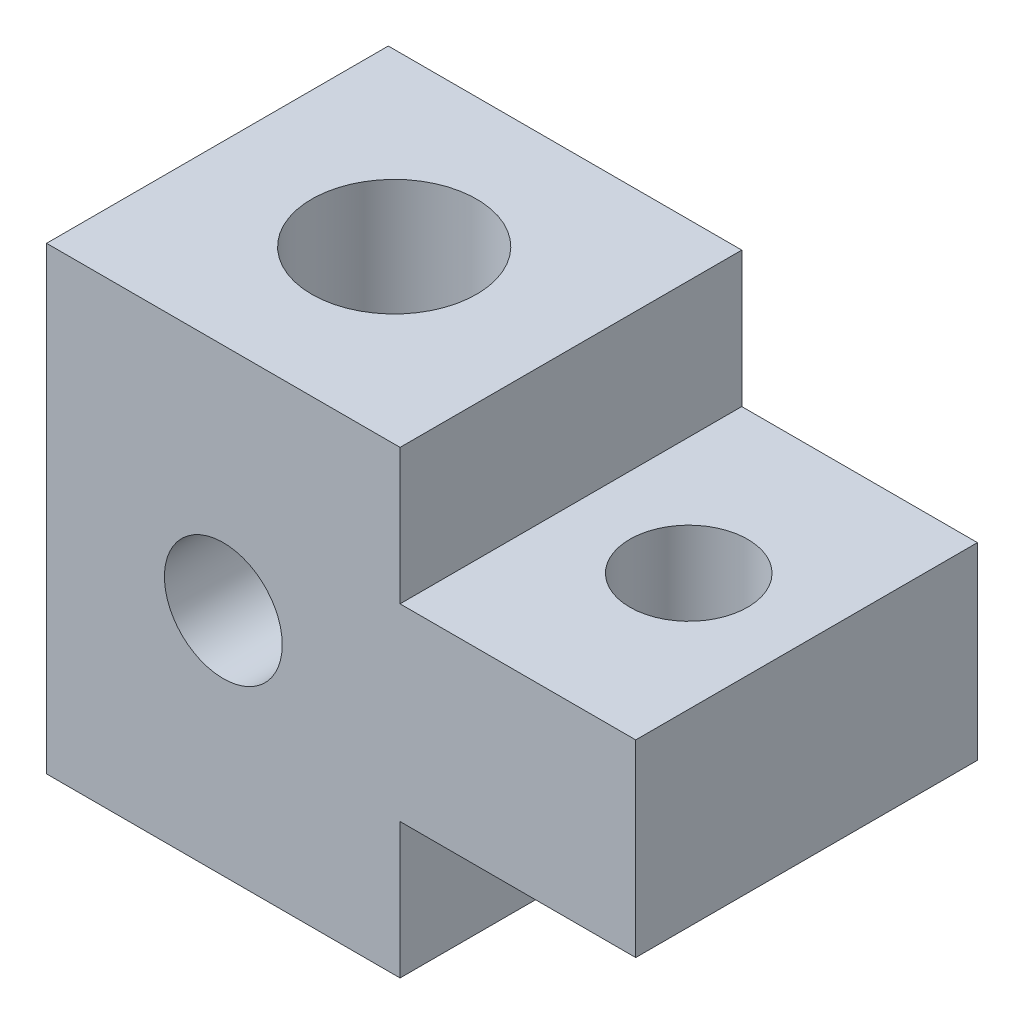
ISO-10303-21;
HEADER;
FILE_DESCRIPTION(('STEP AP214'),'2;1');
FILE_NAME('part.step','',(''),(''),'','','');
FILE_SCHEMA(('AUTOMOTIVE_DESIGN { 1 0 10303 214 1 1 1 1 }'));
ENDSEC;
DATA;
#1=APPLICATION_CONTEXT('core data for automotive mechanical design processes');
#2=APPLICATION_PROTOCOL_DEFINITION('international standard','automotive_design',2000,#1);
#3=PRODUCT_CONTEXT('',#1,'mechanical');
#4=PRODUCT('Part','Part','',(#3));
#5=PRODUCT_RELATED_PRODUCT_CATEGORY('part','',(#4));
#6=PRODUCT_DEFINITION_FORMATION('','',#4);
#7=PRODUCT_DEFINITION_CONTEXT('part definition',#1,'design');
#8=PRODUCT_DEFINITION('design','',#6,#7);
#9=PRODUCT_DEFINITION_SHAPE('','',#8);
#10=(LENGTH_UNIT() NAMED_UNIT(*) SI_UNIT(.MILLI.,.METRE.));
#11=(NAMED_UNIT(*) PLANE_ANGLE_UNIT() SI_UNIT($,.RADIAN.));
#12=(NAMED_UNIT(*) SI_UNIT($,.STERADIAN.) SOLID_ANGLE_UNIT());
#13=UNCERTAINTY_MEASURE_WITH_UNIT(LENGTH_MEASURE(1.E-05),#10,'distance_accuracy_value','');
#14=(GEOMETRIC_REPRESENTATION_CONTEXT(3) GLOBAL_UNCERTAINTY_ASSIGNED_CONTEXT((#13)) GLOBAL_UNIT_ASSIGNED_CONTEXT((#10,
#11,#12)) REPRESENTATION_CONTEXT('',''));
#15=CARTESIAN_POINT('',(0.,0.,0.));
#16=DIRECTION('',(0.,0.,1.));
#17=DIRECTION('',(1.,0.,0.));
#18=AXIS2_PLACEMENT_3D('',#15,#16,#17);
#19=CARTESIAN_POINT('',(0.,0.,29.));
#20=DIRECTION('',(-1.,0.,0.));
#21=DIRECTION('',(0.,0.,1.));
#22=AXIS2_PLACEMENT_3D('',#19,#20,#21);
#23=PLANE('',#22);
#24=DIRECTION('',(0.,1.,0.));
#25=VECTOR('',#24,1.);
#26=CARTESIAN_POINT('',(0.,0.,0.));
#27=LINE('',#26,#25);
#28=CARTESIAN_POINT('',(0.,-19.5,0.));
#29=VERTEX_POINT('',#28);
#30=CARTESIAN_POINT('',(0.,19.5,0.));
#31=VERTEX_POINT('',#30);
#32=EDGE_CURVE('E142',#29,#31,#27,.T.);
#33=ORIENTED_EDGE('',*,*,#32,.F.);
#34=DIRECTION('',(0.,0.,-1.));
#35=VECTOR('',#34,1.);
#36=CARTESIAN_POINT('',(0.,-19.5,29.));
#37=LINE('',#36,#35);
#38=CARTESIAN_POINT('',(0.,-19.5,29.));
#39=VERTEX_POINT('',#38);
#40=EDGE_CURVE('E11',#39,#29,#37,.T.);
#41=ORIENTED_EDGE('',*,*,#40,.F.);
#42=DIRECTION('',(0.,1.,0.));
#43=VECTOR('',#42,1.);
#44=CARTESIAN_POINT('',(0.,0.,29.));
#45=LINE('',#44,#43);
#46=CARTESIAN_POINT('',(0.,19.5,29.));
#47=VERTEX_POINT('',#46);
#48=EDGE_CURVE('E160',#39,#47,#45,.T.);
#49=ORIENTED_EDGE('',*,*,#48,.T.);
#50=DIRECTION('',(0.,0.,-1.));
#51=VECTOR('',#50,1.);
#52=CARTESIAN_POINT('',(0.,19.5,29.));
#53=LINE('',#52,#51);
#54=EDGE_CURVE('E63',#47,#31,#53,.T.);
#55=ORIENTED_EDGE('',*,*,#54,.T.);
#56=EDGE_LOOP('',(#33,#41,#49,#55));
#57=FACE_BOUND('',#56,.T.);
#58=ADVANCED_FACE('F40',(#57),#23,.T.);
#59=CARTESIAN_POINT('',(0.,-19.5,29.));
#60=DIRECTION('',(0.,1.,0.));
#61=DIRECTION('',(0.,0.,1.));
#62=AXIS2_PLACEMENT_3D('',#59,#60,#61);
#63=PLANE('',#62);
#64=CARTESIAN_POINT('',(15.,-19.5,14.5));
#65=DIRECTION('',(0.,1.,0.));
#66=DIRECTION('',(0.,0.,1.));
#67=AXIS2_PLACEMENT_3D('',#64,#65,#66);
#68=CIRCLE('',#67,7.);
#69=CARTESIAN_POINT('',(15.,-19.5,21.5));
#70=VERTEX_POINT('',#69);
#71=EDGE_CURVE('E174',#70,#70,#68,.T.);
#72=ORIENTED_EDGE('',*,*,#71,.T.);
#73=EDGE_LOOP('',(#72));
#74=FACE_BOUND('',#73,.T.);
#75=DIRECTION('',(1.,0.,0.));
#76=VECTOR('',#75,1.);
#77=CARTESIAN_POINT('',(0.,-19.5,0.));
#78=LINE('',#77,#76);
#79=CARTESIAN_POINT('',(30.,-19.5,0.));
#80=VERTEX_POINT('',#79);
#81=EDGE_CURVE('E144',#29,#80,#78,.T.);
#82=ORIENTED_EDGE('',*,*,#81,.T.);
#83=DIRECTION('',(0.,0.,-1.));
#84=VECTOR('',#83,1.);
#85=CARTESIAN_POINT('',(30.,-19.5,29.));
#86=LINE('',#85,#84);
#87=CARTESIAN_POINT('',(30.,-19.5,29.));
#88=VERTEX_POINT('',#87);
#89=EDGE_CURVE('E54',#88,#80,#86,.T.);
#90=ORIENTED_EDGE('',*,*,#89,.F.);
#91=DIRECTION('',(1.,0.,0.));
#92=VECTOR('',#91,1.);
#93=CARTESIAN_POINT('',(0.,-19.5,29.));
#94=LINE('',#93,#92);
#95=EDGE_CURVE('E246',#39,#88,#94,.T.);
#96=ORIENTED_EDGE('',*,*,#95,.F.);
#97=ORIENTED_EDGE('',*,*,#40,.T.);
#98=EDGE_LOOP('',(#82,#90,#96,#97));
#99=FACE_BOUND('',#98,.T.);
#100=ADVANCED_FACE('F198',(#74,#99),#63,.F.);
#101=CARTESIAN_POINT('',(30.,0.,29.));
#102=DIRECTION('',(-1.,0.,0.));
#103=DIRECTION('',(0.,-1.,0.));
#104=AXIS2_PLACEMENT_3D('',#101,#102,#103);
#105=PLANE('',#104);
#106=DIRECTION('',(0.,1.,0.));
#107=VECTOR('',#106,1.);
#108=CARTESIAN_POINT('',(30.,0.,0.));
#109=LINE('',#108,#107);
#110=CARTESIAN_POINT('',(30.,-8.,0.));
#111=VERTEX_POINT('',#110);
#112=EDGE_CURVE('E147',#80,#111,#109,.T.);
#113=ORIENTED_EDGE('',*,*,#112,.T.);
#114=DIRECTION('',(0.,0.,-1.));
#115=VECTOR('',#114,1.);
#116=CARTESIAN_POINT('',(30.,-8.,29.));
#117=LINE('',#116,#115);
#118=CARTESIAN_POINT('',(30.,-8.,29.));
#119=VERTEX_POINT('',#118);
#120=EDGE_CURVE('E167',#119,#111,#117,.T.);
#121=ORIENTED_EDGE('',*,*,#120,.F.);
#122=DIRECTION('',(0.,1.,0.));
#123=VECTOR('',#122,1.);
#124=CARTESIAN_POINT('',(30.,0.,29.));
#125=LINE('',#124,#123);
#126=EDGE_CURVE('E245',#88,#119,#125,.T.);
#127=ORIENTED_EDGE('',*,*,#126,.F.);
#128=ORIENTED_EDGE('',*,*,#89,.T.);
#129=EDGE_LOOP('',(#113,#121,#127,#128));
#130=FACE_BOUND('',#129,.T.);
#131=ADVANCED_FACE('F202',(#130),#105,.F.);
#132=CARTESIAN_POINT('',(0.,-8.,29.));
#133=DIRECTION('',(0.,1.,0.));
#134=DIRECTION('',(0.,0.,1.));
#135=AXIS2_PLACEMENT_3D('',#132,#133,#134);
#136=PLANE('',#135);
#137=CARTESIAN_POINT('',(40.,-8.,14.5));
#138=DIRECTION('',(0.,1.,0.));
#139=DIRECTION('',(0.,0.,1.));
#140=AXIS2_PLACEMENT_3D('',#137,#138,#139);
#141=CIRCLE('',#140,5.);
#142=CARTESIAN_POINT('',(40.,-8.,19.5));
#143=VERTEX_POINT('',#142);
#144=EDGE_CURVE('E145',#143,#143,#141,.T.);
#145=ORIENTED_EDGE('',*,*,#144,.T.);
#146=EDGE_LOOP('',(#145));
#147=FACE_BOUND('',#146,.T.);
#148=DIRECTION('',(1.,0.,0.));
#149=VECTOR('',#148,1.);
#150=CARTESIAN_POINT('',(0.,-8.,0.));
#151=LINE('',#150,#149);
#152=CARTESIAN_POINT('',(50.,-8.,0.));
#153=VERTEX_POINT('',#152);
#154=EDGE_CURVE('E149',#111,#153,#151,.T.);
#155=ORIENTED_EDGE('',*,*,#154,.T.);
#156=DIRECTION('',(0.,0.,-1.));
#157=VECTOR('',#156,1.);
#158=CARTESIAN_POINT('',(50.,-8.,29.));
#159=LINE('',#158,#157);
#160=CARTESIAN_POINT('',(50.,-8.,29.));
#161=VERTEX_POINT('',#160);
#162=EDGE_CURVE('E164',#161,#153,#159,.T.);
#163=ORIENTED_EDGE('',*,*,#162,.F.);
#164=DIRECTION('',(1.,0.,0.));
#165=VECTOR('',#164,1.);
#166=CARTESIAN_POINT('',(0.,-8.,29.));
#167=LINE('',#166,#165);
#168=EDGE_CURVE('E137',#119,#161,#167,.T.);
#169=ORIENTED_EDGE('',*,*,#168,.F.);
#170=ORIENTED_EDGE('',*,*,#120,.T.);
#171=EDGE_LOOP('',(#155,#163,#169,#170));
#172=FACE_BOUND('',#171,.T.);
#173=ADVANCED_FACE('F228',(#147,#172),#136,.F.);
#174=CARTESIAN_POINT('',(50.,0.,29.));
#175=DIRECTION('',(-1.,0.,0.));
#176=DIRECTION('',(0.,-1.,0.));
#177=AXIS2_PLACEMENT_3D('',#174,#175,#176);
#178=PLANE('',#177);
#179=DIRECTION('',(0.,1.,0.));
#180=VECTOR('',#179,1.);
#181=CARTESIAN_POINT('',(50.,0.,0.));
#182=LINE('',#181,#180);
#183=CARTESIAN_POINT('',(50.,8.,0.));
#184=VERTEX_POINT('',#183);
#185=EDGE_CURVE('E151',#153,#184,#182,.T.);
#186=ORIENTED_EDGE('',*,*,#185,.T.);
#187=DIRECTION('',(0.,0.,-1.));
#188=VECTOR('',#187,1.);
#189=CARTESIAN_POINT('',(50.,8.,29.));
#190=LINE('',#189,#188);
#191=CARTESIAN_POINT('',(50.,8.,29.));
#192=VERTEX_POINT('',#191);
#193=EDGE_CURVE('E123',#192,#184,#190,.T.);
#194=ORIENTED_EDGE('',*,*,#193,.F.);
#195=DIRECTION('',(0.,1.,0.));
#196=VECTOR('',#195,1.);
#197=CARTESIAN_POINT('',(50.,0.,29.));
#198=LINE('',#197,#196);
#199=EDGE_CURVE('E134',#161,#192,#198,.T.);
#200=ORIENTED_EDGE('',*,*,#199,.F.);
#201=ORIENTED_EDGE('',*,*,#162,.T.);
#202=EDGE_LOOP('',(#186,#194,#200,#201));
#203=FACE_BOUND('',#202,.T.);
#204=ADVANCED_FACE('F224',(#203),#178,.F.);
#205=CARTESIAN_POINT('',(0.,8.,29.));
#206=DIRECTION('',(0.,1.,0.));
#207=DIRECTION('',(0.,0.,1.));
#208=AXIS2_PLACEMENT_3D('',#205,#206,#207);
#209=PLANE('',#208);
#210=CARTESIAN_POINT('',(40.,8.,14.5));
#211=DIRECTION('',(0.,1.,0.));
#212=DIRECTION('',(0.,0.,1.));
#213=AXIS2_PLACEMENT_3D('',#210,#211,#212);
#214=CIRCLE('',#213,5.);
#215=CARTESIAN_POINT('',(40.,8.,19.5));
#216=VERTEX_POINT('',#215);
#217=EDGE_CURVE('E172',#216,#216,#214,.T.);
#218=ORIENTED_EDGE('',*,*,#217,.F.);
#219=EDGE_LOOP('',(#218));
#220=FACE_BOUND('',#219,.T.);
#221=DIRECTION('',(1.,0.,0.));
#222=VECTOR('',#221,1.);
#223=CARTESIAN_POINT('',(0.,8.,0.));
#224=LINE('',#223,#222);
#225=CARTESIAN_POINT('',(30.,8.,0.));
#226=VERTEX_POINT('',#225);
#227=EDGE_CURVE('E120',#226,#184,#224,.T.);
#228=ORIENTED_EDGE('',*,*,#227,.F.);
#229=DIRECTION('',(0.,0.,-1.));
#230=VECTOR('',#229,1.);
#231=CARTESIAN_POINT('',(30.,8.,29.));
#232=LINE('',#231,#230);
#233=CARTESIAN_POINT('',(30.,8.,29.));
#234=VERTEX_POINT('',#233);
#235=EDGE_CURVE('E114',#234,#226,#232,.T.);
#236=ORIENTED_EDGE('',*,*,#235,.F.);
#237=DIRECTION('',(1.,0.,0.));
#238=VECTOR('',#237,1.);
#239=CARTESIAN_POINT('',(0.,8.,29.));
#240=LINE('',#239,#238);
#241=EDGE_CURVE('E118',#234,#192,#240,.T.);
#242=ORIENTED_EDGE('',*,*,#241,.T.);
#243=ORIENTED_EDGE('',*,*,#193,.T.);
#244=EDGE_LOOP('',(#228,#236,#242,#243));
#245=FACE_BOUND('',#244,.T.);
#246=ADVANCED_FACE('F116',(#220,#245),#209,.T.);
#247=CARTESIAN_POINT('',(30.,0.,29.));
#248=DIRECTION('',(-1.,0.,0.));
#249=DIRECTION('',(0.,-1.,0.));
#250=AXIS2_PLACEMENT_3D('',#247,#248,#249);
#251=PLANE('',#250);
#252=DIRECTION('',(0.,1.,0.));
#253=VECTOR('',#252,1.);
#254=CARTESIAN_POINT('',(30.,0.,0.));
#255=LINE('',#254,#253);
#256=CARTESIAN_POINT('',(30.,19.5,0.));
#257=VERTEX_POINT('',#256);
#258=EDGE_CURVE('E155',#226,#257,#255,.T.);
#259=ORIENTED_EDGE('',*,*,#258,.T.);
#260=DIRECTION('',(0.,0.,-1.));
#261=VECTOR('',#260,1.);
#262=CARTESIAN_POINT('',(30.,19.5,29.));
#263=LINE('',#262,#261);
#264=CARTESIAN_POINT('',(30.,19.5,29.));
#265=VERTEX_POINT('',#264);
#266=EDGE_CURVE('E89',#265,#257,#263,.T.);
#267=ORIENTED_EDGE('',*,*,#266,.F.);
#268=DIRECTION('',(0.,1.,0.));
#269=VECTOR('',#268,1.);
#270=CARTESIAN_POINT('',(30.,0.,29.));
#271=LINE('',#270,#269);
#272=EDGE_CURVE('E125',#234,#265,#271,.T.);
#273=ORIENTED_EDGE('',*,*,#272,.F.);
#274=ORIENTED_EDGE('',*,*,#235,.T.);
#275=EDGE_LOOP('',(#259,#267,#273,#274));
#276=FACE_BOUND('',#275,.T.);
#277=ADVANCED_FACE('F126',(#276),#251,.F.);
#278=CARTESIAN_POINT('',(0.,19.5,29.));
#279=DIRECTION('',(0.,1.,0.));
#280=DIRECTION('',(0.,0.,1.));
#281=AXIS2_PLACEMENT_3D('',#278,#279,#280);
#282=PLANE('',#281);
#283=CARTESIAN_POINT('',(15.,19.5,14.5));
#284=DIRECTION('',(0.,1.,0.));
#285=DIRECTION('',(0.,0.,1.));
#286=AXIS2_PLACEMENT_3D('',#283,#284,#285);
#287=CIRCLE('',#286,7.);
#288=CARTESIAN_POINT('',(15.,19.5,21.5));
#289=VERTEX_POINT('',#288);
#290=EDGE_CURVE('E253',#289,#289,#287,.T.);
#291=ORIENTED_EDGE('',*,*,#290,.F.);
#292=EDGE_LOOP('',(#291));
#293=FACE_BOUND('',#292,.T.);
#294=DIRECTION('',(1.,0.,0.));
#295=VECTOR('',#294,1.);
#296=CARTESIAN_POINT('',(0.,19.5,0.));
#297=LINE('',#296,#295);
#298=EDGE_CURVE('E157',#31,#257,#297,.T.);
#299=ORIENTED_EDGE('',*,*,#298,.F.);
#300=ORIENTED_EDGE('',*,*,#54,.F.);
#301=DIRECTION('',(1.,0.,0.));
#302=VECTOR('',#301,1.);
#303=CARTESIAN_POINT('',(0.,19.5,29.));
#304=LINE('',#303,#302);
#305=EDGE_CURVE('E129',#47,#265,#304,.T.);
#306=ORIENTED_EDGE('',*,*,#305,.T.);
#307=ORIENTED_EDGE('',*,*,#266,.T.);
#308=EDGE_LOOP('',(#299,#300,#306,#307));
#309=FACE_BOUND('',#308,.T.);
#310=ADVANCED_FACE('F208',(#293,#309),#282,.T.);
#311=CARTESIAN_POINT('',(0.,0.,29.));
#312=DIRECTION('',(0.,0.,1.));
#313=DIRECTION('',(1.,0.,0.));
#314=AXIS2_PLACEMENT_3D('',#311,#312,#313);
#315=PLANE('',#314);
#316=CARTESIAN_POINT('',(15.,0.,29.));
#317=DIRECTION('',(0.,0.,1.));
#318=DIRECTION('',(1.,0.,0.));
#319=AXIS2_PLACEMENT_3D('',#316,#317,#318);
#320=CIRCLE('',#319,5.);
#321=CARTESIAN_POINT('',(20.,0.,29.));
#322=VERTEX_POINT('',#321);
#323=EDGE_CURVE('E258',#322,#322,#320,.T.);
#324=ORIENTED_EDGE('',*,*,#323,.F.);
#325=EDGE_LOOP('',(#324));
#326=FACE_BOUND('',#325,.T.);
#327=ORIENTED_EDGE('',*,*,#48,.F.);
#328=ORIENTED_EDGE('',*,*,#95,.T.);
#329=ORIENTED_EDGE('',*,*,#126,.T.);
#330=ORIENTED_EDGE('',*,*,#168,.T.);
#331=ORIENTED_EDGE('',*,*,#199,.T.);
#332=ORIENTED_EDGE('',*,*,#241,.F.);
#333=ORIENTED_EDGE('',*,*,#272,.T.);
#334=ORIENTED_EDGE('',*,*,#305,.F.);
#335=EDGE_LOOP('',(#327,#328,#329,#330,#331,#332,#333,#334));
#336=FACE_BOUND('',#335,.T.);
#337=ADVANCED_FACE('F132',(#326,#336),#315,.T.);
#338=CARTESIAN_POINT('',(0.,0.,0.));
#339=DIRECTION('',(0.,0.,1.));
#340=DIRECTION('',(1.,0.,0.));
#341=AXIS2_PLACEMENT_3D('',#338,#339,#340);
#342=PLANE('',#341);
#343=CARTESIAN_POINT('',(15.,0.,0.));
#344=DIRECTION('',(0.,0.,1.));
#345=DIRECTION('',(1.,0.,0.));
#346=AXIS2_PLACEMENT_3D('',#343,#344,#345);
#347=CIRCLE('',#346,5.);
#348=CARTESIAN_POINT('',(20.,0.,0.));
#349=VERTEX_POINT('',#348);
#350=EDGE_CURVE('E180',#349,#349,#347,.T.);
#351=ORIENTED_EDGE('',*,*,#350,.T.);
#352=EDGE_LOOP('',(#351));
#353=FACE_BOUND('',#352,.T.);
#354=ORIENTED_EDGE('',*,*,#32,.T.);
#355=ORIENTED_EDGE('',*,*,#298,.T.);
#356=ORIENTED_EDGE('',*,*,#258,.F.);
#357=ORIENTED_EDGE('',*,*,#227,.T.);
#358=ORIENTED_EDGE('',*,*,#185,.F.);
#359=ORIENTED_EDGE('',*,*,#154,.F.);
#360=ORIENTED_EDGE('',*,*,#112,.F.);
#361=ORIENTED_EDGE('',*,*,#81,.F.);
#362=EDGE_LOOP('',(#354,#355,#356,#357,#358,#359,#360,#361));
#363=FACE_BOUND('',#362,.T.);
#364=ADVANCED_FACE('F206',(#353,#363),#342,.F.);
#365=CARTESIAN_POINT('',(15.,-19.5,14.5));
#366=DIRECTION('',(0.,1.,0.));
#367=DIRECTION('',(0.,0.,1.));
#368=AXIS2_PLACEMENT_3D('',#365,#366,#367);
#369=CYLINDRICAL_SURFACE('',#368,7.);
#370=CARTESIAN_POINT('',(15.,-5.,21.5));
#371=CARTESIAN_POINT('',(15.1237068303478,-5.00000022354689,21.5000002083897));
#372=CARTESIAN_POINT('',(15.2474109734859,-4.99540268236403,21.4967139987286));
#373=CARTESIAN_POINT('',(15.4938425975991,-4.9770866330283,21.4836487700132));
#374=CARTESIAN_POINT('',(15.6165696836214,-4.96336460886491,21.47386724807));
#375=CARTESIAN_POINT('',(15.8600169345434,-4.92701920398555,21.4480468434639));
#376=CARTESIAN_POINT('',(15.9807372109681,-4.90439631965455,21.4320083097439));
#377=CARTESIAN_POINT('',(16.2193522544136,-4.8505822220875,21.3940398006315));
#378=CARTESIAN_POINT('',(16.337245778989,-4.81938731360941,21.3721072845419));
#379=CARTESIAN_POINT('',(16.5687667129468,-4.74905518598892,21.3229681756075));
#380=CARTESIAN_POINT('',(16.6824140482932,-4.7099626730664,21.2957913068071));
#381=CARTESIAN_POINT('',(16.9055407556229,-4.62419933209123,21.2366356869967));
#382=CARTESIAN_POINT('',(17.015018468878,-4.57752552618601,21.2046550494895));
#383=CARTESIAN_POINT('',(17.3363458262758,-4.42689176531504,21.1024157337307));
#384=CARTESIAN_POINT('',(17.5412920922653,-4.31225689851121,21.0258150865612));
#385=CARTESIAN_POINT('',(17.9472271057568,-4.0469663323332,20.8534913611025));
#386=CARTESIAN_POINT('',(18.1462142745355,-3.89400284839666,20.7566696574209));
#387=CARTESIAN_POINT('',(18.5175794624028,-3.56212571592813,20.555675892893));
#388=CARTESIAN_POINT('',(18.6899168163273,-3.38317320178477,20.4514929455646));
#389=CARTESIAN_POINT('',(18.9417150806784,-3.07967434652797,20.2858016978197));
#390=CARTESIAN_POINT('',(19.0303997489177,-2.96268462237239,20.2242087657962));
#391=CARTESIAN_POINT('',(19.1975674072437,-2.72067323014133,20.1027747899902));
#392=CARTESIAN_POINT('',(19.2760476158605,-2.5956493859919,20.0429342272873));
#393=CARTESIAN_POINT('',(19.4221828056056,-2.33798898871932,19.9270606468648));
#394=CARTESIAN_POINT('',(19.4898529542352,-2.20536346311908,19.8710223589023));
#395=CARTESIAN_POINT('',(19.6138165816614,-1.93265550407132,19.7649167619883));
#396=CARTESIAN_POINT('',(19.6701118152847,-1.79257422505407,19.7148485325155));
#397=CARTESIAN_POINT('',(19.7883819882449,-1.45392718891214,19.6068520627755));
#398=CARTESIAN_POINT('',(19.8452297576885,-1.25231171384458,19.5524828289815));
#399=CARTESIAN_POINT('',(19.9114809508396,-0.942613825930413,19.4878146392407));
#400=CARTESIAN_POINT('',(19.9303898846231,-0.838222893942562,19.4690780208219));
#401=CARTESIAN_POINT('',(19.9616043001113,-0.627536658122381,19.4379119891256));
#402=CARTESIAN_POINT('',(19.9739123930579,-0.521242124562244,19.425480081859));
#403=CARTESIAN_POINT('',(19.9917480683448,-0.306774863448635,19.4074041133857));
#404=CARTESIAN_POINT('',(19.9972289628403,-0.198594278535291,19.4018067956449));
#405=CARTESIAN_POINT('',(20.0011406737656,0.018026812155505,19.3978158819255));
#406=CARTESIAN_POINT('',(19.9995717082929,0.126467309788454,19.3994220630963));
#407=CARTESIAN_POINT('',(19.9894149735773,0.342728889399177,19.4097647058501));
#408=CARTESIAN_POINT('',(19.9808235702943,0.450549621555851,19.4185048591878));
#409=CARTESIAN_POINT('',(19.9567929298247,0.664698469556404,19.4427211452074));
#410=CARTESIAN_POINT('',(19.9413502757023,0.771025813267917,19.4582006389399));
#411=CARTESIAN_POINT('',(19.9015128448887,0.994825081469284,19.4976045137859));
#412=CARTESIAN_POINT('',(19.8762291146884,1.11199391044315,19.522352721421));
#413=CARTESIAN_POINT('',(19.8177974068345,1.34276673574007,19.5784318922348));
#414=CARTESIAN_POINT('',(19.7846441363586,1.45636827432981,19.609767284131));
#415=CARTESIAN_POINT('',(19.6740034304818,1.79137244482136,19.7118827784335));
#416=CARTESIAN_POINT('',(19.5853748634202,2.00675876983909,19.790730179967));
#417=CARTESIAN_POINT('',(19.4169965993863,2.34795400956389,19.9311797705645));
#418=CARTESIAN_POINT('',(19.3447082131295,2.47905841197644,19.9893641542145));
#419=CARTESIAN_POINT('',(19.1893796615404,2.73336368670041,20.1088043498466));
#420=CARTESIAN_POINT('',(19.1063364523486,2.85656230667667,20.1700610283391));
#421=CARTESIAN_POINT('',(18.9298928370481,3.0948256692271,20.293752422172));
#422=CARTESIAN_POINT('',(18.8364839658793,3.20988363634828,20.3561880652648));
#423=CARTESIAN_POINT('',(18.6396760458075,3.43142884548283,20.4804935423999));
#424=CARTESIAN_POINT('',(18.5362780182164,3.53791696165917,20.5423634335792));
#425=CARTESIAN_POINT('',(18.3186556640219,3.74287189987029,20.6645971137388));
#426=CARTESIAN_POINT('',(18.2043325719399,3.84124688182488,20.7249393899914));
#427=CARTESIAN_POINT('',(17.9660798341746,4.02806126698584,20.841922220594));
#428=CARTESIAN_POINT('',(17.8421515315496,4.11650205503039,20.8985632904349));
#429=CARTESIAN_POINT('',(17.5853474928163,4.282441595,21.006561832049));
#430=CARTESIAN_POINT('',(17.4524884180763,4.35995993066672,21.0579287142745));
#431=CARTESIAN_POINT('',(17.1782999787835,4.50321099396806,21.1540279477666));
#432=CARTESIAN_POINT('',(17.0369738272187,4.56894815486164,21.1987627935706));
#433=CARTESIAN_POINT('',(16.783931615894,4.67238732567145,21.2697990016776));
#434=CARTESIAN_POINT('',(16.6738819069136,4.71296020505671,21.2978892012711));
#435=CARTESIAN_POINT('',(16.4501624186313,4.78653173163408,21.3491012015955));
#436=CARTESIAN_POINT('',(16.3364934229023,4.81953200576215,21.3722240694642));
#437=CARTESIAN_POINT('',(16.1062069974651,4.87754047313569,21.4130294524658));
#438=CARTESIAN_POINT('',(15.9895904206767,4.90255095039585,21.4307135223144));
#439=CARTESIAN_POINT('',(15.7541980866974,4.94423541095641,21.4602620246516));
#440=CARTESIAN_POINT('',(15.6354233247658,4.96091314066347,21.4721290724302));
#441=CARTESIAN_POINT('',(15.3960965319406,4.98574292901636,21.4898180326742));
#442=CARTESIAN_POINT('',(15.2755396127856,4.99386380215022,21.4956178324723));
#443=CARTESIAN_POINT('',(15.0340589156116,5.00134248653213,21.5009584900912));
#444=CARTESIAN_POINT('',(14.9131352881085,5.00070350582503,21.5005016392307));
#445=CARTESIAN_POINT('',(14.67180512613,4.99067905827532,21.4933443490271));
#446=CARTESIAN_POINT('',(14.5513987432328,4.9812911827097,21.4866421902422));
#447=CARTESIAN_POINT('',(14.3120731614909,4.95391409391108,21.4671495485143));
#448=CARTESIAN_POINT('',(14.193153935293,4.93592503911972,21.4543591777217));
#449=CARTESIAN_POINT('',(13.9633096592253,4.89267642285578,21.4237316910525));
#450=CARTESIAN_POINT('',(13.8522746932901,4.86780680389531,21.4061659472229));
#451=CARTESIAN_POINT('',(13.63296957382,4.81082965042213,21.3661252063098));
#452=CARTESIAN_POINT('',(13.5247003324381,4.77871976147637,21.3436486123617));
#453=CARTESIAN_POINT('',(13.2049790875377,4.6720751794697,21.2694642183435));
#454=CARTESIAN_POINT('',(12.9984429392385,4.58719279091312,21.2109781581856));
#455=CARTESIAN_POINT('',(12.5841986603694,4.38428228559054,21.0738749186399));
#456=CARTESIAN_POINT('',(12.3780882781875,4.26394370379289,20.9939116774269));
#457=CARTESIAN_POINT('',(11.9880905387077,3.99802088983066,20.8224863713839));
#458=CARTESIAN_POINT('',(11.8042205996458,3.85241708497908,20.7310154068679));
#459=CARTESIAN_POINT('',(11.4289649986847,3.51046418552866,20.5250635299762));
#460=CARTESIAN_POINT('',(11.2422424595551,3.30970030994848,20.4094144469246));
#461=CARTESIAN_POINT('',(10.9033987479568,2.87973003591422,20.1797636047222));
#462=CARTESIAN_POINT('',(10.7512960309951,2.65050856713162,20.0657627544113));
#463=CARTESIAN_POINT('',(10.5053112964043,2.20283415030589,19.8683022581351));
#464=CARTESIAN_POINT('',(10.4060577756204,1.98822765934173,19.7828482769832));
#465=CARTESIAN_POINT('',(10.2374924544777,1.54119845383935,19.6314134563618));
#466=CARTESIAN_POINT('',(10.1681173142735,1.30881467056927,19.5653915175496));
#467=CARTESIAN_POINT('',(10.0730589186697,0.874635590327753,19.4728114094957));
#468=CARTESIAN_POINT('',(10.0416444672883,0.675204805589688,19.4411932348565));
#469=CARTESIAN_POINT('',(10.0032905339342,0.271727661799286,19.4024179281004));
#470=CARTESIAN_POINT('',(9.99632376843682,0.0676867038902371,19.39523352826));
#471=CARTESIAN_POINT('',(10.0073570494927,-0.338985086671419,19.4064807507208));
#472=CARTESIAN_POINT('',(10.0253587865855,-0.541615822908721,19.4249141075205));
#473=CARTESIAN_POINT('',(10.0850128903445,-0.940022478739679,19.4844376091799));
#474=CARTESIAN_POINT('',(10.1267018450441,-1.13578729517115,19.5255628017284));
#475=CARTESIAN_POINT('',(10.2493097498364,-1.58144229450417,19.6420026145228));
#476=CARTESIAN_POINT('',(10.3387347735511,-1.82719751183545,19.7241801755376));
#477=CARTESIAN_POINT('',(10.4978958827436,-2.17892594636776,19.8605950862375));
#478=CARTESIAN_POINT('',(10.5552043249241,-2.29347906606927,19.908323575642));
#479=CARTESIAN_POINT('',(10.6777902855062,-2.51688646084673,20.0067859749154));
#480=CARTESIAN_POINT('',(10.7430672023857,-2.62574116519784,20.0575196577805));
#481=CARTESIAN_POINT('',(10.9540930980594,-2.94925921285559,20.2150565273302));
#482=CARTESIAN_POINT('',(11.1122324360849,-3.15471125862949,20.3246762563742));
#483=CARTESIAN_POINT('',(11.3720448903262,-3.44306381155547,20.4873591406586));
#484=CARTESIAN_POINT('',(11.4624632431679,-3.53591534986612,20.5413201532754));
#485=CARTESIAN_POINT('',(11.6507691606072,-3.71476958843104,20.6477090151437));
#486=CARTESIAN_POINT('',(11.7486580568824,-3.80077106200219,20.7001365887339));
#487=CARTESIAN_POINT('',(11.9691359575996,-3.97961408278736,20.811229079519));
#488=CARTESIAN_POINT('',(12.093078474785,-4.07109049129995,20.8694171698058));
#489=CARTESIAN_POINT('',(12.3504316301116,-4.24307934442603,20.9806964505025));
#490=CARTESIAN_POINT('',(12.4838379487561,-4.32359674262621,21.0337899405018));
#491=CARTESIAN_POINT('',(12.7593908703568,-4.47260288918066,21.1333330541782));
#492=CARTESIAN_POINT('',(12.9015284861155,-4.5411037351815,21.1797893509917));
#493=CARTESIAN_POINT('',(13.1936857251307,-4.66501640104234,21.2646387872472));
#494=CARTESIAN_POINT('',(13.3437022632867,-4.72043329807614,21.3030350537081));
#495=CARTESIAN_POINT('',(13.6166891018412,-4.80647655817349,21.3630525808118));
#496=CARTESIAN_POINT('',(13.7383903852094,-4.83987416056432,21.3865060472747));
#497=CARTESIAN_POINT('',(13.9849573681896,-4.89752048853468,21.4271413549575));
#498=CARTESIAN_POINT('',(14.1098223656501,-4.92177122550463,21.4443245749739));
#499=CARTESIAN_POINT('',(14.3616708905162,-4.96072173678099,21.4719848193134));
#500=CARTESIAN_POINT('',(14.4886527065831,-4.97542887580563,21.4824670146707));
#501=CARTESIAN_POINT('',(14.7437573105584,-4.99506788304421,21.4964744909744));
#502=CARTESIAN_POINT('',(14.8718800964565,-4.99999976847837,21.4999997841763));
#503=CARTESIAN_POINT('',(15.,-5.,21.5));
#504=B_SPLINE_CURVE_WITH_KNOTS('',3,(#370,#371,#372,#373,#374,#375,#376,#377,#378,#379,#380,
#381,#382,#383,#384,#385,#386,#387,#388,#389,#390,#391,#392,#393,#394,#395,#396,#397,#398,#399,
#400,#401,#402,#403,#404,#405,#406,#407,#408,#409,#410,#411,#412,#413,#414,#415,#416,#417,#418,
#419,#420,#421,#422,#423,#424,#425,#426,#427,#428,#429,#430,#431,#432,#433,#434,#435,#436,#437,
#438,#439,#440,#441,#442,#443,#444,#445,#446,#447,#448,#449,#450,#451,#452,#453,#454,#455,#456,
#457,#458,#459,#460,#461,#462,#463,#464,#465,#466,#467,#468,#469,#470,#471,#472,#473,#474,#475,
#476,#477,#478,#479,#480,#481,#482,#483,#484,#485,#486,#487,#488,#489,#490,#491,#492,#493,#494,
#495,#496,#497,#498,#499,#500,#501,#502,#503),.UNSPECIFIED.,.T.,.F.,(4,2,2,2,2,2,2,2,2,2,2,2,2,
2,2,2,2,2,2,2,2,2,2,2,2,2,2,2,2,2,2,2,2,2,2,2,2,2,2,2,2,2,2,2,2,2,2,2,2,2,2,2,2,2,2,2,2,2,2,2,2,
2,2,2,2,2,4),(0.,0.370988075311342,0.742119189353148,1.11322960901298,1.48450025920444,
1.85372534219338,2.22309580520344,2.96119440682995,3.76545645669382,4.57093387736644,
5.04808282383801,5.52536155725331,6.00196462889924,6.47849411798938,7.12486898649108,
7.44773292534192,7.77046904731893,8.09540029733772,8.42032149521341,8.74541094303565,
9.07066270584136,9.43729317449982,9.80417093025883,10.5385885670457,11.0199765172867,
11.501501010235,11.9834216722646,12.4652931137676,12.9520296640933,13.4386982783501,
13.9244828884573,14.4100843121038,14.7715471013432,15.1329321592676,15.4942138166987,
15.8553328952545,16.2177635696493,16.5800615177667,16.9424592422916,17.304850291374,
17.6498662512386,17.9949945676154,18.6847309611871,19.4371210061711,20.190096543024,
21.0793568967469,21.9690902023821,22.7207890020039,23.4708863194346,24.0812720855668,
24.690976446486,25.3007220906012,25.9114121377249,26.7290171085949,27.1388076467791,
27.5485672699122,28.3895670350435,28.810455633468,29.2314194343296,29.724740195124,
30.2178372239682,30.7104349429707,31.2028411960805,31.5874461531241,31.9719664863837,
32.356189734384,32.7404123055309),.UNSPECIFIED.);
#505=CARTESIAN_POINT('',(15.,-5.,21.5));
#506=VERTEX_POINT('',#505);
#507=EDGE_CURVE('E43',#506,#506,#504,.T.);
#508=ORIENTED_EDGE('',*,*,#507,.T.);
#509=EDGE_LOOP('',(#508));
#510=FACE_BOUND('',#509,.T.);
#511=CARTESIAN_POINT('',(20.,0.,9.60102051443364));
#512=CARTESIAN_POINT('',(20.000000197881,-0.119112081484849,9.60102091384223));
#513=CARTESIAN_POINT('',(19.99573415755,-0.238221824137471,9.59665537996805));
#514=CARTESIAN_POINT('',(19.9787838362571,-0.475214081546395,9.5794456583145));
#515=CARTESIAN_POINT('',(19.9660993069414,-0.593096559992977,9.56660122039913));
#516=CARTESIAN_POINT('',(19.9325837955962,-0.82678825625921,9.5330920764248));
#517=CARTESIAN_POINT('',(19.911737236218,-0.942593064183815,9.51241241919178));
#518=CARTESIAN_POINT('',(19.8623215386829,-1.1711181474123,9.4642261149331));
#519=CARTESIAN_POINT('',(19.8337479783789,-1.28383661560458,9.43671555933801));
#520=CARTESIAN_POINT('',(19.7379331530823,-1.61366896762829,9.34639826193019));
#521=CARTESIAN_POINT('',(19.6601365289646,-1.82553112575171,9.27531156790238));
#522=CARTESIAN_POINT('',(19.4794712261494,-2.23249426507427,9.11961558537444));
#523=CARTESIAN_POINT('',(19.3766035238625,-2.42759589862359,9.03500682354482));
#524=CARTESIAN_POINT('',(19.1267251554986,-2.83501050021564,8.84320809423728));
#525=CARTESIAN_POINT('',(18.9750733473289,-3.04387168313207,8.73472978829622));
#526=CARTESIAN_POINT('',(18.6411199886308,-3.43637515163447,8.51820252901906));
#527=CARTESIAN_POINT('',(18.4587778791208,-3.61998347287628,8.41015434010694));
#528=CARTESIAN_POINT('',(18.1461628521475,-3.88908919103796,8.24549290521417));
#529=CARTESIAN_POINT('',(18.025301670224,-3.98388906472554,8.18599561899712));
#530=CARTESIAN_POINT('',(17.7738432548624,-4.16288441532026,8.07155884923844));
#531=CARTESIAN_POINT('',(17.6432441291975,-4.24707782264051,8.01662025592346));
#532=CARTESIAN_POINT('',(17.3731522158486,-4.40368906684223,7.91296399908754));
#533=CARTESIAN_POINT('',(17.2336750462623,-4.47612682825644,7.86423584030553));
#534=CARTESIAN_POINT('',(16.946495689953,-4.60826487626794,7.7743954931323));
#535=CARTESIAN_POINT('',(16.7987973299599,-4.66797102756902,7.73327979928113));
#536=CARTESIAN_POINT('',(16.5385136279984,-4.75881706299345,7.67024206658132));
#537=CARTESIAN_POINT('',(16.4275981624119,-4.79328240087366,7.64616307351015));
#538=CARTESIAN_POINT('',(16.202711829935,-4.85459142435606,7.60314714930796));
#539=CARTESIAN_POINT('',(16.0887415888099,-4.8814366580597,7.58420917376126));
#540=CARTESIAN_POINT('',(15.8585113600546,-4.92714152434114,7.55187341579876));
#541=CARTESIAN_POINT('',(15.7422528966372,-4.94600629617554,7.53847206803673));
#542=CARTESIAN_POINT('',(15.5081679111512,-4.97550809444896,7.51748089376953));
#543=CARTESIAN_POINT('',(15.390341335118,-4.98614483698185,7.50989126779647));
#544=CARTESIAN_POINT('',(15.1537650478745,-4.99904160573773,7.5006860030355));
#545=CARTESIAN_POINT('',(15.0350139841175,-5.00128524840541,7.49908204845283));
#546=CARTESIAN_POINT('',(14.7976833319845,-4.99731514434666,7.50191763673995));
#547=CARTESIAN_POINT('',(14.6791038212029,-4.9910983371032,7.50635936659992));
#548=CARTESIAN_POINT('',(14.4430775123281,-4.97029887371255,7.52118793552693));
#549=CARTESIAN_POINT('',(14.3256305435278,-4.95571749904261,7.53157386392405));
#550=CARTESIAN_POINT('',(14.0926534717402,-4.91839889421114,7.55806400750836));
#551=CARTESIAN_POINT('',(13.9771241273329,-4.89565851331304,7.5741704317363));
#552=CARTESIAN_POINT('',(13.751810842166,-4.84304126523075,7.61126214275269));
#553=CARTESIAN_POINT('',(13.6419557695553,-4.81336928105005,7.63210696866672));
#554=CARTESIAN_POINT('',(13.4254089107991,-4.74694714117306,7.67849384451727));
#555=CARTESIAN_POINT('',(13.3187182302381,-4.71019454447857,7.70403751421408));
#556=CARTESIAN_POINT('',(13.0042452650913,-4.58990803299052,7.78703823180123));
#557=CARTESIAN_POINT('',(12.8018967237085,-4.49630607375869,7.85089320364311));
#558=CARTESIAN_POINT('',(12.3933712519119,-4.27382379329945,7.99938819508041));
#559=CARTESIAN_POINT('',(12.1892834695381,-4.14217349009016,8.08555194449334));
#560=CARTESIAN_POINT('',(11.804835833498,-3.85341261291793,8.26812855010363));
#561=CARTESIAN_POINT('',(11.6245003779098,-3.69627622391645,8.36455176375998));
#562=CARTESIAN_POINT('',(11.3574788032059,-3.4281007556956,8.52125824284958));
#563=CARTESIAN_POINT('',(11.2625639076269,-3.32435127876477,8.58026681334792));
#564=CARTESIAN_POINT('',(11.0818087823054,-3.10926127496148,8.69832667987265));
#565=CARTESIAN_POINT('',(10.9959666203705,-2.99792237272764,8.75737796409434));
#566=CARTESIAN_POINT('',(10.8336194816542,-2.76786783627172,8.87405410780346));
#567=CARTESIAN_POINT('',(10.757116553193,-2.64915059238569,8.9316786521709));
#568=CARTESIAN_POINT('',(10.6138932081794,-2.40461309974678,9.04377929548918));
#569=CARTESIAN_POINT('',(10.5471712584153,-2.27879396853794,9.09825588708269));
#570=CARTESIAN_POINT('',(10.3901915890014,-1.94905767375445,9.23073044890348));
#571=CARTESIAN_POINT('',(10.3070870936225,-1.74014361134037,9.30524841136629));
#572=CARTESIAN_POINT('',(10.2032987250876,-1.41581919406254,9.40157839235241));
#573=CARTESIAN_POINT('',(10.1721876774459,-1.3059246012185,9.43110649845975));
#574=CARTESIAN_POINT('',(10.1173193416127,-1.08286716116777,9.48393806898604));
#575=CARTESIAN_POINT('',(10.0935582800938,-0.969706023669287,9.50724472652009));
#576=CARTESIAN_POINT('',(10.0535718064168,-0.739374553093571,9.546853868878));
#577=CARTESIAN_POINT('',(10.037441699768,-0.622172176313291,9.56306758874195));
#578=CARTESIAN_POINT('',(10.0135153760429,-0.386066333713212,9.58723470489115));
#579=CARTESIAN_POINT('',(10.0057187377752,-0.267162954173575,9.59518851864913));
#580=CARTESIAN_POINT('',(9.9986648912386,-0.0289001790493672,9.60238048904827));
#581=CARTESIAN_POINT('',(9.99940260236255,0.0904589029423158,9.60162383114565));
#582=CARTESIAN_POINT('',(10.0093739400643,0.328413175347431,9.59146769290833));
#583=CARTESIAN_POINT('',(10.0186070428179,0.447008412405374,9.58206874545548));
#584=CARTESIAN_POINT('',(10.0544990699016,0.762625463713742,9.54590023016821));
#585=CARTESIAN_POINT('',(10.0887464554889,0.957997031441285,9.51165690450149));
#586=CARTESIAN_POINT('',(10.1787164136906,1.33933216451718,9.42465983118202));
#587=CARTESIAN_POINT('',(10.2344642625162,1.52528436414777,9.37188430340385));
#588=CARTESIAN_POINT('',(10.3967715930059,1.97253245518479,9.22484908653982));
#589=CARTESIAN_POINT('',(10.514876263853,2.22714649498673,9.1228367874866));
#590=CARTESIAN_POINT('',(10.7199167336707,2.58846682584317,8.96027067152411));
#591=CARTESIAN_POINT('',(10.7930334226984,2.70562377019019,8.90440531736322));
#592=CARTESIAN_POINT('',(10.9482595598456,2.93297165821402,8.79100453506983));
#593=CARTESIAN_POINT('',(11.0303679303832,3.04316343412025,8.73346930766448));
#594=CARTESIAN_POINT('',(11.2936648543003,3.36777583544017,8.55793529358169));
#595=CARTESIAN_POINT('',(11.4888055378416,3.57091859368839,8.43951790590134));
#596=CARTESIAN_POINT('',(11.9133743701994,3.94365193921038,8.21265759265213));
#597=CARTESIAN_POINT('',(12.1427544883486,4.11328876588332,8.10420103302028));
#598=CARTESIAN_POINT('',(12.5971662408152,4.39161810987672,7.92147258977139));
#599=CARTESIAN_POINT('',(12.8178140206091,4.50561518093442,7.84451690571098));
#600=CARTESIAN_POINT('',(13.1633631906197,4.65214702674922,7.74417083600278));
#601=CARTESIAN_POINT('',(13.2810124819493,4.69692322407885,7.71322986152154));
#602=CARTESIAN_POINT('',(13.5205556389937,4.77778170721923,7.6570220285296));
#603=CARTESIAN_POINT('',(13.6424476021973,4.8138678338073,7.63175266365704));
#604=CARTESIAN_POINT('',(13.8905352403341,4.8770468352244,7.58732475789926));
#605=CARTESIAN_POINT('',(14.0167543398959,4.90407761688988,7.56820844255688));
#606=CARTESIAN_POINT('',(14.271742454396,4.94837166117467,7.53680120923332));
#607=CARTESIAN_POINT('',(14.4005114818428,4.96563487586759,7.52451032474239));
#608=CARTESIAN_POINT('',(14.6594319828314,4.99008175935719,7.50708626868096));
#609=CARTESIAN_POINT('',(14.7895828521558,4.99726966442758,7.50195008884257));
#610=CARTESIAN_POINT('',(15.0501254143713,5.00144558108577,7.49896756405446));
#611=CARTESIAN_POINT('',(15.1805170842656,4.9984345209627,7.50112055565912));
#612=CARTESIAN_POINT('',(15.4263285531437,4.98314519793188,7.51203087681492));
#613=CARTESIAN_POINT('',(15.5418475443845,4.97190056417114,7.52005150031115));
#614=CARTESIAN_POINT('',(15.7713483494199,4.94150029255682,7.54167326398594));
#615=CARTESIAN_POINT('',(15.8853296409775,4.9223420335978,7.55527625311382));
#616=CARTESIAN_POINT('',(16.110935720572,4.87637852628486,7.58777875123787));
#617=CARTESIAN_POINT('',(16.2225611533977,4.84957540023124,7.60667679024352));
#618=CARTESIAN_POINT('',(16.442851751491,4.78865960737675,7.64939458413943));
#619=CARTESIAN_POINT('',(16.5515157506753,4.75454410684676,7.67321624692963));
#620=CARTESIAN_POINT('',(16.8771147334339,4.64005181905655,7.75263224718206));
#621=CARTESIAN_POINT('',(17.0885305206196,4.54858666560375,7.81541539493514));
#622=CARTESIAN_POINT('',(17.4929363761146,4.34017934153938,7.95544400061808));
#623=CARTESIAN_POINT('',(17.6859230340988,4.22323246860436,8.03269212750328));
#624=CARTESIAN_POINT('',(18.0799396502617,3.94720282455907,8.20973091887426));
#625=CARTESIAN_POINT('',(18.277623644719,3.78440371686023,8.3111609272009));
#626=CARTESIAN_POINT('',(18.6447983499169,3.43224884380423,8.52002344321729));
#627=CARTESIAN_POINT('',(18.8142355187103,3.2428438709024,8.62746684600284));
#628=CARTESIAN_POINT('',(19.0591143209182,2.92330595281575,8.79599189904408));
#629=CARTESIAN_POINT('',(19.1444531072191,2.80104733507575,8.85787390769531));
#630=CARTESIAN_POINT('',(19.3044398920657,2.54836450998118,8.97896314059713));
#631=CARTESIAN_POINT('',(19.3790851526481,2.41793822362322,9.03816967717474));
#632=CARTESIAN_POINT('',(19.5169442944716,2.14940894135715,9.15161940528379));
#633=CARTESIAN_POINT('',(19.5801765653467,2.01131877229407,9.20587051049364));
#634=CARTESIAN_POINT('',(19.6945663723654,1.72755050027632,9.3070353521775));
#635=CARTESIAN_POINT('',(19.7457230244497,1.58187184271882,9.35394855135667));
#636=CARTESIAN_POINT('',(19.8243152613173,1.31911577496218,9.42770643782083));
#637=CARTESIAN_POINT('',(19.8544991691347,1.2034538532674,9.45667168293067));
#638=CARTESIAN_POINT('',(19.9067075325435,0.96883612551587,9.50745049125341));
#639=CARTESIAN_POINT('',(19.9287387639516,0.849883143494335,9.52926999166368));
#640=CARTESIAN_POINT('',(19.9641584766189,0.609768970566067,9.56464177103903));
#641=CARTESIAN_POINT('',(19.9775679655513,0.488613892400772,9.57821414043072));
#642=CARTESIAN_POINT('',(19.9954883480415,0.244971662742327,9.5964030275258));
#643=CARTESIAN_POINT('',(19.9999997965163,0.122484594796382,9.60102010371629));
#644=CARTESIAN_POINT('',(20.,0.,9.60102051443364));
#645=B_SPLINE_CURVE_WITH_KNOTS('',3,(#511,#512,#513,#514,#515,#516,#517,#518,#519,#520,#521,
#522,#523,#524,#525,#526,#527,#528,#529,#530,#531,#532,#533,#534,#535,#536,#537,#538,#539,#540,
#541,#542,#543,#544,#545,#546,#547,#548,#549,#550,#551,#552,#553,#554,#555,#556,#557,#558,#559,
#560,#561,#562,#563,#564,#565,#566,#567,#568,#569,#570,#571,#572,#573,#574,#575,#576,#577,#578,
#579,#580,#581,#582,#583,#584,#585,#586,#587,#588,#589,#590,#591,#592,#593,#594,#595,#596,#597,
#598,#599,#600,#601,#602,#603,#604,#605,#606,#607,#608,#609,#610,#611,#612,#613,#614,#615,#616,
#617,#618,#619,#620,#621,#622,#623,#624,#625,#626,#627,#628,#629,#630,#631,#632,#633,#634,#635,
#636,#637,#638,#639,#640,#641,#642,#643,#644),.UNSPECIFIED.,.T.,.F.,(4,2,2,2,2,2,2,2,2,2,2,2,2,
2,2,2,2,2,2,2,2,2,2,2,2,2,2,2,2,2,2,2,2,2,2,2,2,2,2,2,2,2,2,2,2,2,2,2,2,2,2,2,2,2,2,2,2,2,2,2,2,
2,2,2,2,2,4),(0.,0.357179224350199,0.71436898630992,1.07224379920534,1.43032385816536,
2.13717251113089,2.84399363978166,3.68104205097159,4.51920548229731,5.01279154518473,
5.50647377037363,5.9993103164021,6.4919193488521,6.84740956232524,7.20282750258062,
7.55801621113095,7.91321717483286,8.26911113958429,8.62513388107041,8.98110209334731,
9.33720791691036,9.68388561620712,10.0306830450948,10.7237665684956,11.4941350433091,
12.2652887597734,12.7223782704213,13.1793702391326,13.6364622578756,14.0934825486357,
14.8010785406531,15.1546369551107,15.508013557753,15.8656941258335,16.2233566151193,
16.5808061943249,16.9382337347385,17.5393225125418,18.1411201024382,19.0318005816484,
19.4783995312192,19.9249450178902,20.8376513563764,21.7490891887235,22.5255899396739,
22.9140682910686,23.3023746290684,23.693291570444,24.0842104299097,24.4749648739275,
24.8656837532241,25.2142975726098,25.5630269505635,25.9116596114256,26.2604276212735,
26.9736540085442,27.6870121242051,28.5103350386147,29.3352012440718,29.8189986384765,
30.3029196834961,30.7860538917519,31.2692234594306,31.6377462890185,32.0059621419414,
32.3732773683434,32.7405696867955),.UNSPECIFIED.);
#646=CARTESIAN_POINT('',(20.,0.,9.60102051443364));
#647=VERTEX_POINT('',#646);
#648=EDGE_CURVE('E175',#647,#647,#645,.T.);
#649=ORIENTED_EDGE('',*,*,#648,.T.);
#650=EDGE_LOOP('',(#649));
#651=FACE_BOUND('',#650,.T.);
#652=ORIENTED_EDGE('',*,*,#71,.F.);
#653=EDGE_LOOP('',(#652));
#654=FACE_BOUND('',#653,.T.);
#655=ORIENTED_EDGE('',*,*,#290,.T.);
#656=EDGE_LOOP('',(#655));
#657=FACE_BOUND('',#656,.T.);
#658=ADVANCED_FACE('F181',(#510,#651,#654,#657),#369,.F.);
#659=CARTESIAN_POINT('',(40.,-19.5,14.5));
#660=DIRECTION('',(0.,1.,0.));
#661=DIRECTION('',(0.,0.,1.));
#662=AXIS2_PLACEMENT_3D('',#659,#660,#661);
#663=CYLINDRICAL_SURFACE('',#662,5.);
#664=CARTESIAN_POINT('',(40.,8.,19.5));
#665=CARTESIAN_POINT('',(40.,7.83333333333333,19.5));
#666=CARTESIAN_POINT('',(40.,7.66666666666666,19.5));
#667=CARTESIAN_POINT('',(40.,7.33333333333333,19.5));
#668=CARTESIAN_POINT('',(40.,7.16666666666666,19.5));
#669=CARTESIAN_POINT('',(40.,6.83333333333333,19.5));
#670=CARTESIAN_POINT('',(40.,6.66666666666666,19.5));
#671=CARTESIAN_POINT('',(40.,6.33333333333333,19.5));
#672=CARTESIAN_POINT('',(40.,6.16666666666666,19.5));
#673=CARTESIAN_POINT('',(40.,5.83333333333333,19.5));
#674=CARTESIAN_POINT('',(40.,5.66666666666666,19.5));
#675=CARTESIAN_POINT('',(40.,5.33333333333333,19.5));
#676=CARTESIAN_POINT('',(40.,5.16666666666666,19.5));
#677=CARTESIAN_POINT('',(40.,4.83333333333333,19.5));
#678=CARTESIAN_POINT('',(40.,4.66666666666666,19.5));
#679=CARTESIAN_POINT('',(40.,4.33333333333333,19.5));
#680=CARTESIAN_POINT('',(40.,4.16666666666666,19.5));
#681=CARTESIAN_POINT('',(40.,3.83333333333333,19.5));
#682=CARTESIAN_POINT('',(40.,3.66666666666667,19.5));
#683=CARTESIAN_POINT('',(40.,3.33333333333333,19.5));
#684=CARTESIAN_POINT('',(40.,3.16666666666667,19.5));
#685=CARTESIAN_POINT('',(40.,2.83333333333333,19.5));
#686=CARTESIAN_POINT('',(40.,2.66666666666667,19.5));
#687=CARTESIAN_POINT('',(40.,2.33333333333333,19.5));
#688=CARTESIAN_POINT('',(40.,2.16666666666667,19.5));
#689=CARTESIAN_POINT('',(40.,1.83333333333333,19.5));
#690=CARTESIAN_POINT('',(40.,1.66666666666666,19.5));
#691=CARTESIAN_POINT('',(40.,1.33333333333333,19.5));
#692=CARTESIAN_POINT('',(40.,1.16666666666666,19.5));
#693=CARTESIAN_POINT('',(40.,0.833333333333331,19.5));
#694=CARTESIAN_POINT('',(40.,0.666666666666664,19.5));
#695=CARTESIAN_POINT('',(40.,0.33333333333333,19.5));
#696=CARTESIAN_POINT('',(40.,0.166666666666663,19.5));
#697=CARTESIAN_POINT('',(40.,-0.16666666666667,19.5));
#698=CARTESIAN_POINT('',(40.,-0.333333333333337,19.5));
#699=CARTESIAN_POINT('',(40.,-0.66666666666667,19.5));
#700=CARTESIAN_POINT('',(40.,-0.833333333333335,19.5));
#701=CARTESIAN_POINT('',(40.,-1.16666666666667,19.5));
#702=CARTESIAN_POINT('',(40.,-1.33333333333333,19.5));
#703=CARTESIAN_POINT('',(40.,-1.66666666666667,19.5));
#704=CARTESIAN_POINT('',(40.,-1.83333333333334,19.5));
#705=CARTESIAN_POINT('',(40.,-2.16666666666667,19.5));
#706=CARTESIAN_POINT('',(40.,-2.33333333333333,19.5));
#707=CARTESIAN_POINT('',(40.,-2.66666666666667,19.5));
#708=CARTESIAN_POINT('',(40.,-2.83333333333333,19.5));
#709=CARTESIAN_POINT('',(40.,-3.16666666666667,19.5));
#710=CARTESIAN_POINT('',(40.,-3.33333333333333,19.5));
#711=CARTESIAN_POINT('',(40.,-3.66666666666667,19.5));
#712=CARTESIAN_POINT('',(40.,-3.83333333333333,19.5));
#713=CARTESIAN_POINT('',(40.,-4.16666666666667,19.5));
#714=CARTESIAN_POINT('',(40.,-4.33333333333333,19.5));
#715=CARTESIAN_POINT('',(40.,-4.66666666666667,19.5));
#716=CARTESIAN_POINT('',(40.,-4.83333333333333,19.5));
#717=CARTESIAN_POINT('',(40.,-5.16666666666667,19.5));
#718=CARTESIAN_POINT('',(40.,-5.33333333333333,19.5));
#719=CARTESIAN_POINT('',(40.,-5.66666666666667,19.5));
#720=CARTESIAN_POINT('',(40.,-5.83333333333333,19.5));
#721=CARTESIAN_POINT('',(40.,-6.16666666666667,19.5));
#722=CARTESIAN_POINT('',(40.,-6.33333333333333,19.5));
#723=CARTESIAN_POINT('',(40.,-6.66666666666667,19.5));
#724=CARTESIAN_POINT('',(40.,-6.83333333333333,19.5));
#725=CARTESIAN_POINT('',(40.,-7.16666666666667,19.5));
#726=CARTESIAN_POINT('',(40.,-7.33333333333333,19.5));
#727=CARTESIAN_POINT('',(40.,-7.66666666666667,19.5));
#728=CARTESIAN_POINT('',(40.,-7.83333333333333,19.5));
#729=CARTESIAN_POINT('',(40.,-8.,19.5));
#730=B_SPLINE_CURVE_WITH_KNOTS('',3,(#664,#665,#666,#667,#668,#669,#670,#671,#672,#673,#674,
#675,#676,#677,#678,#679,#680,#681,#682,#683,#684,#685,#686,#687,#688,#689,#690,#691,#692,#693,
#694,#695,#696,#697,#698,#699,#700,#701,#702,#703,#704,#705,#706,#707,#708,#709,#710,#711,#712,
#713,#714,#715,#716,#717,#718,#719,#720,#721,#722,#723,#724,#725,#726,#727,#728,#729),
.UNSPECIFIED.,.F.,.F.,(4,2,2,2,2,2,2,2,2,2,2,2,2,2,2,2,2,2,2,2,2,2,2,2,2,2,2,2,2,2,2,2,4),(0.,
0.5,1.,1.5,2.,2.5,3.,3.5,4.,4.5,5.,5.5,6.,6.5,7.,7.5,8.,8.5,9.,9.5,10.,10.5,11.,11.5,12.,12.5,
13.,13.5,14.,14.5,15.,15.5,16.),.UNSPECIFIED.);
#731=EDGE_CURVE('BSEAM193',#216,#143,#730,.T.);
#732=ORIENTED_EDGE('',*,*,#217,.T.);
#733=ORIENTED_EDGE('',*,*,#144,.F.);
#734=ORIENTED_EDGE('',*,*,#731,.T.);
#735=ORIENTED_EDGE('',*,*,#731,.F.);
#736=EDGE_LOOP('',(#732,#734,#733,#735));
#737=FACE_BOUND('',#736,.T.);
#738=ADVANCED_FACE('F193',(#737),#663,.F.);
#739=CARTESIAN_POINT('',(15.,0.,0.));
#740=DIRECTION('',(0.,0.,1.));
#741=DIRECTION('',(1.,0.,0.));
#742=AXIS2_PLACEMENT_3D('',#739,#740,#741);
#743=CYLINDRICAL_SURFACE('',#742,5.);
#744=ORIENTED_EDGE('',*,*,#350,.F.);
#745=EDGE_LOOP('',(#744));
#746=FACE_BOUND('',#745,.T.);
#747=ORIENTED_EDGE('',*,*,#648,.F.);
#748=EDGE_LOOP('',(#747));
#749=FACE_BOUND('',#748,.T.);
#750=ADVANCED_FACE('F187',(#746,#749),#743,.F.);
#751=ORIENTED_EDGE('',*,*,#323,.T.);
#752=EDGE_LOOP('',(#751));
#753=FACE_BOUND('',#752,.T.);
#754=ORIENTED_EDGE('',*,*,#507,.F.);
#755=EDGE_LOOP('',(#754));
#756=FACE_BOUND('',#755,.T.);
#757=ADVANCED_FACE('F184',(#753,#756),#743,.F.);
#758=CLOSED_SHELL('',(#58,#100,#131,#173,#204,#246,#277,#310,#337,#364,#658,#738,#750,#757));
#759=MANIFOLD_SOLID_BREP('B2',#758);
#760=ADVANCED_BREP_SHAPE_REPRESENTATION('',(#18,#759),#14);
#761=SHAPE_DEFINITION_REPRESENTATION(#9,#760);
ENDSEC;
END-ISO-10303-21;
